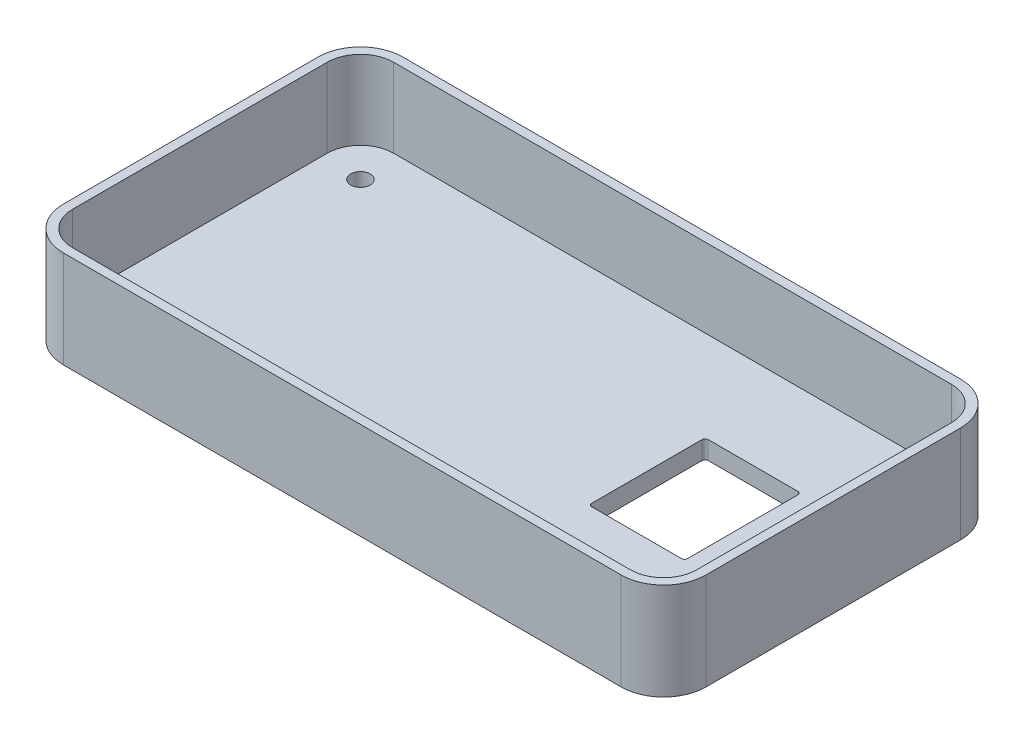
ISO-10303-21;
HEADER;
FILE_DESCRIPTION(('STEP AP214'),'2;1');
FILE_NAME('part.step','',(''),(''),'','','');
FILE_SCHEMA(('AUTOMOTIVE_DESIGN { 1 0 10303 214 1 1 1 1 }'));
ENDSEC;
DATA;
#1=APPLICATION_CONTEXT('core data for automotive mechanical design processes');
#2=APPLICATION_PROTOCOL_DEFINITION('international standard','automotive_design',2000,#1);
#3=PRODUCT_CONTEXT('',#1,'mechanical');
#4=PRODUCT('Part','Part','',(#3));
#5=PRODUCT_RELATED_PRODUCT_CATEGORY('part','',(#4));
#6=PRODUCT_DEFINITION_FORMATION('','',#4);
#7=PRODUCT_DEFINITION_CONTEXT('part definition',#1,'design');
#8=PRODUCT_DEFINITION('design','',#6,#7);
#9=PRODUCT_DEFINITION_SHAPE('','',#8);
#10=(LENGTH_UNIT() NAMED_UNIT(*) SI_UNIT(.MILLI.,.METRE.));
#11=(NAMED_UNIT(*) PLANE_ANGLE_UNIT() SI_UNIT($,.RADIAN.));
#12=(NAMED_UNIT(*) SI_UNIT($,.STERADIAN.) SOLID_ANGLE_UNIT());
#13=UNCERTAINTY_MEASURE_WITH_UNIT(LENGTH_MEASURE(1.E-05),#10,'distance_accuracy_value','');
#14=(GEOMETRIC_REPRESENTATION_CONTEXT(3) GLOBAL_UNCERTAINTY_ASSIGNED_CONTEXT((#13)) GLOBAL_UNIT_ASSIGNED_CONTEXT((#10,
#11,#12)) REPRESENTATION_CONTEXT('',''));
#15=CARTESIAN_POINT('',(0.,0.,0.));
#16=DIRECTION('',(0.,0.,1.));
#17=DIRECTION('',(1.,0.,0.));
#18=AXIS2_PLACEMENT_3D('',#15,#16,#17);
#19=CARTESIAN_POINT('',(0.,3.,-17.327051435572));
#20=DIRECTION('',(0.,0.,1.));
#21=DIRECTION('',(1.,0.,0.));
#22=AXIS2_PLACEMENT_3D('',#19,#20,#21);
#23=PLANE('',#22);
#24=DIRECTION('',(-1.,0.,0.));
#25=VECTOR('',#24,1.);
#26=CARTESIAN_POINT('',(0.,0.,-17.327051435572));
#27=LINE('',#26,#25);
#28=CARTESIAN_POINT('',(85.627156503708,0.,-17.327051435572));
#29=VERTEX_POINT('',#28);
#30=CARTESIAN_POINT('',(70.827156816136,0.,-17.327051435572));
#31=VERTEX_POINT('',#30);
#32=EDGE_CURVE('E233',#29,#31,#27,.T.);
#33=ORIENTED_EDGE('',*,*,#32,.T.);
#34=DIRECTION('',(0.,-1.,0.));
#35=VECTOR('',#34,1.);
#36=CARTESIAN_POINT('',(70.827156816136,3.,-17.327051435572));
#37=LINE('',#36,#35);
#38=CARTESIAN_POINT('',(70.827156816136,3.,-17.327051435572));
#39=VERTEX_POINT('',#38);
#40=EDGE_CURVE('E11',#39,#31,#37,.T.);
#41=ORIENTED_EDGE('',*,*,#40,.F.);
#42=DIRECTION('',(-1.,0.,0.));
#43=VECTOR('',#42,1.);
#44=CARTESIAN_POINT('',(0.,3.,-17.327051435572));
#45=LINE('',#44,#43);
#46=CARTESIAN_POINT('',(85.627156503708,3.,-17.327051435572));
#47=VERTEX_POINT('',#46);
#48=EDGE_CURVE('E451',#47,#39,#45,.T.);
#49=ORIENTED_EDGE('',*,*,#48,.F.);
#50=DIRECTION('',(0.,-1.,0.));
#51=VECTOR('',#50,1.);
#52=CARTESIAN_POINT('',(85.627156503708,3.,-17.327051435572));
#53=LINE('',#52,#51);
#54=EDGE_CURVE('E70',#47,#29,#53,.T.);
#55=ORIENTED_EDGE('',*,*,#54,.T.);
#56=EDGE_LOOP('',(#33,#41,#49,#55));
#57=FACE_BOUND('',#56,.T.);
#58=ADVANCED_FACE('F43',(#57),#23,.F.);
#59=CARTESIAN_POINT('',(70.827156816136,3.,-17.827051425017));
#60=DIRECTION('',(0.,-1.,0.));
#61=DIRECTION('',(0.,0.,-1.));
#62=AXIS2_PLACEMENT_3D('',#59,#60,#61);
#63=CYLINDRICAL_SURFACE('',#62,0.499999989445029);
#64=CARTESIAN_POINT('',(70.827156816136,0.,-17.827051425017));
#65=DIRECTION('',(0.,1.,0.));
#66=DIRECTION('',(0.,0.,1.));
#67=AXIS2_PLACEMENT_3D('',#64,#65,#66);
#68=CIRCLE('',#67,0.499999989445029);
#69=CARTESIAN_POINT('',(70.327156826691,0.,-17.827051425017));
#70=VERTEX_POINT('',#69);
#71=EDGE_CURVE('E236',#31,#70,#68,.F.);
#72=ORIENTED_EDGE('',*,*,#71,.T.);
#73=DIRECTION('',(0.,-1.,0.));
#74=VECTOR('',#73,1.);
#75=CARTESIAN_POINT('',(70.327156826691,3.,-17.827051425017));
#76=LINE('',#75,#74);
#77=CARTESIAN_POINT('',(70.327156826691,3.,-17.827051425017));
#78=VERTEX_POINT('',#77);
#79=EDGE_CURVE('E53',#78,#70,#76,.T.);
#80=ORIENTED_EDGE('',*,*,#79,.F.);
#81=CARTESIAN_POINT('',(70.827156816136,3.,-17.827051425017));
#82=DIRECTION('',(0.,1.,0.));
#83=DIRECTION('',(0.,0.,1.));
#84=AXIS2_PLACEMENT_3D('',#81,#82,#83);
#85=CIRCLE('',#84,0.499999989445029);
#86=EDGE_CURVE('E133',#39,#78,#85,.F.);
#87=ORIENTED_EDGE('',*,*,#86,.F.);
#88=ORIENTED_EDGE('',*,*,#40,.T.);
#89=EDGE_LOOP('',(#72,#80,#87,#88));
#90=FACE_BOUND('',#89,.T.);
#91=ADVANCED_FACE('F472',(#90),#63,.F.);
#92=CARTESIAN_POINT('',(70.327156826691,3.,0.));
#93=DIRECTION('',(-1.,0.,0.));
#94=DIRECTION('',(0.,0.,1.));
#95=AXIS2_PLACEMENT_3D('',#92,#93,#94);
#96=PLANE('',#95);
#97=DIRECTION('',(0.,0.,-1.));
#98=VECTOR('',#97,1.);
#99=CARTESIAN_POINT('',(70.327156826691,0.,0.));
#100=LINE('',#99,#98);
#101=CARTESIAN_POINT('',(70.327156826691,0.,-36.027051040815));
#102=VERTEX_POINT('',#101);
#103=EDGE_CURVE('E239',#70,#102,#100,.T.);
#104=ORIENTED_EDGE('',*,*,#103,.T.);
#105=DIRECTION('',(0.,-1.,0.));
#106=VECTOR('',#105,1.);
#107=CARTESIAN_POINT('',(70.327156826691,3.,-36.027051040815));
#108=LINE('',#107,#106);
#109=CARTESIAN_POINT('',(70.327156826691,3.,-36.027051040815));
#110=VERTEX_POINT('',#109);
#111=EDGE_CURVE('E269',#110,#102,#108,.T.);
#112=ORIENTED_EDGE('',*,*,#111,.F.);
#113=DIRECTION('',(0.,0.,-1.));
#114=VECTOR('',#113,1.);
#115=CARTESIAN_POINT('',(70.327156826691,3.,0.));
#116=LINE('',#115,#114);
#117=EDGE_CURVE('E456',#78,#110,#116,.T.);
#118=ORIENTED_EDGE('',*,*,#117,.F.);
#119=ORIENTED_EDGE('',*,*,#79,.T.);
#120=EDGE_LOOP('',(#104,#112,#118,#119));
#121=FACE_BOUND('',#120,.T.);
#122=ADVANCED_FACE('F475',(#121),#96,.F.);
#123=CARTESIAN_POINT('',(70.827156816136,3.,-36.027051040815));
#124=DIRECTION('',(0.,-1.,0.));
#125=DIRECTION('',(0.,0.,-1.));
#126=AXIS2_PLACEMENT_3D('',#123,#124,#125);
#127=CYLINDRICAL_SURFACE('',#126,0.499999989445003);
#128=CARTESIAN_POINT('',(70.827156816136,0.,-36.027051040815));
#129=DIRECTION('',(0.,1.,0.));
#130=DIRECTION('',(0.,0.,1.));
#131=AXIS2_PLACEMENT_3D('',#128,#129,#130);
#132=CIRCLE('',#131,0.499999989445003);
#133=CARTESIAN_POINT('',(70.827156816136,0.,-36.52705103026));
#134=VERTEX_POINT('',#133);
#135=EDGE_CURVE('E242',#102,#134,#132,.F.);
#136=ORIENTED_EDGE('',*,*,#135,.T.);
#137=DIRECTION('',(0.,-1.,0.));
#138=VECTOR('',#137,1.);
#139=CARTESIAN_POINT('',(70.827156816136,3.,-36.52705103026));
#140=LINE('',#139,#138);
#141=CARTESIAN_POINT('',(70.827156816136,3.,-36.52705103026));
#142=VERTEX_POINT('',#141);
#143=EDGE_CURVE('E265',#142,#134,#140,.T.);
#144=ORIENTED_EDGE('',*,*,#143,.F.);
#145=CARTESIAN_POINT('',(70.827156816136,3.,-36.027051040815));
#146=DIRECTION('',(0.,1.,0.));
#147=DIRECTION('',(0.,0.,1.));
#148=AXIS2_PLACEMENT_3D('',#145,#146,#147);
#149=CIRCLE('',#148,0.499999989445003);
#150=EDGE_CURVE('E180',#110,#142,#149,.F.);
#151=ORIENTED_EDGE('',*,*,#150,.F.);
#152=ORIENTED_EDGE('',*,*,#111,.T.);
#153=EDGE_LOOP('',(#136,#144,#151,#152));
#154=FACE_BOUND('',#153,.T.);
#155=ADVANCED_FACE('F464',(#154),#127,.F.);
#156=CARTESIAN_POINT('',(0.,3.,-36.52705103026));
#157=DIRECTION('',(0.,0.,-1.));
#158=DIRECTION('',(-1.,0.,0.));
#159=AXIS2_PLACEMENT_3D('',#156,#157,#158);
#160=PLANE('',#159);
#161=DIRECTION('',(1.,0.,0.));
#162=VECTOR('',#161,1.);
#163=CARTESIAN_POINT('',(0.,0.,-36.52705103026));
#164=LINE('',#163,#162);
#165=CARTESIAN_POINT('',(85.627156503708,0.,-36.52705103026));
#166=VERTEX_POINT('',#165);
#167=EDGE_CURVE('E245',#134,#166,#164,.T.);
#168=ORIENTED_EDGE('',*,*,#167,.T.);
#169=DIRECTION('',(0.,-1.,0.));
#170=VECTOR('',#169,1.);
#171=CARTESIAN_POINT('',(85.627156503708,3.,-36.52705103026));
#172=LINE('',#171,#170);
#173=CARTESIAN_POINT('',(85.627156503708,3.,-36.52705103026));
#174=VERTEX_POINT('',#173);
#175=EDGE_CURVE('E162',#174,#166,#172,.T.);
#176=ORIENTED_EDGE('',*,*,#175,.F.);
#177=DIRECTION('',(1.,0.,0.));
#178=VECTOR('',#177,1.);
#179=CARTESIAN_POINT('',(0.,3.,-36.52705103026));
#180=LINE('',#179,#178);
#181=EDGE_CURVE('E175',#142,#174,#180,.T.);
#182=ORIENTED_EDGE('',*,*,#181,.F.);
#183=ORIENTED_EDGE('',*,*,#143,.T.);
#184=EDGE_LOOP('',(#168,#176,#182,#183));
#185=FACE_BOUND('',#184,.T.);
#186=ADVANCED_FACE('F468',(#185),#160,.F.);
#187=CARTESIAN_POINT('',(85.627156503708,3.,-36.027051040815));
#188=DIRECTION('',(0.,-1.,0.));
#189=DIRECTION('',(0.,0.,-1.));
#190=AXIS2_PLACEMENT_3D('',#187,#188,#189);
#191=CYLINDRICAL_SURFACE('',#190,0.499999989444996);
#192=CARTESIAN_POINT('',(85.627156503708,0.,-36.027051040815));
#193=DIRECTION('',(0.,1.,0.));
#194=DIRECTION('',(0.,0.,1.));
#195=AXIS2_PLACEMENT_3D('',#192,#193,#194);
#196=CIRCLE('',#195,0.499999989444996);
#197=CARTESIAN_POINT('',(86.127156493153,0.,-36.027051040815));
#198=VERTEX_POINT('',#197);
#199=EDGE_CURVE('E157',#198,#166,#196,.T.);
#200=ORIENTED_EDGE('',*,*,#199,.F.);
#201=DIRECTION('',(0.,-1.,0.));
#202=VECTOR('',#201,1.);
#203=CARTESIAN_POINT('',(86.127156493153,3.,-36.027051040815));
#204=LINE('',#203,#202);
#205=CARTESIAN_POINT('',(86.127156493153,3.,-36.027051040815));
#206=VERTEX_POINT('',#205);
#207=EDGE_CURVE('E151',#206,#198,#204,.T.);
#208=ORIENTED_EDGE('',*,*,#207,.F.);
#209=CARTESIAN_POINT('',(85.627156503708,3.,-36.027051040815));
#210=DIRECTION('',(0.,1.,0.));
#211=DIRECTION('',(0.,0.,1.));
#212=AXIS2_PLACEMENT_3D('',#209,#210,#211);
#213=CIRCLE('',#212,0.499999989444996);
#214=EDGE_CURVE('E155',#206,#174,#213,.T.);
#215=ORIENTED_EDGE('',*,*,#214,.T.);
#216=ORIENTED_EDGE('',*,*,#175,.T.);
#217=EDGE_LOOP('',(#200,#208,#215,#216));
#218=FACE_BOUND('',#217,.T.);
#219=ADVANCED_FACE('F153',(#218),#191,.F.);
#220=CARTESIAN_POINT('',(86.127156493153,3.,0.));
#221=DIRECTION('',(1.,0.,0.));
#222=DIRECTION('',(0.,0.,-1.));
#223=AXIS2_PLACEMENT_3D('',#220,#221,#222);
#224=PLANE('',#223);
#225=DIRECTION('',(0.,0.,1.));
#226=VECTOR('',#225,1.);
#227=CARTESIAN_POINT('',(86.127156493153,0.,0.));
#228=LINE('',#227,#226);
#229=CARTESIAN_POINT('',(86.127156493153,0.,-17.827051425017));
#230=VERTEX_POINT('',#229);
#231=EDGE_CURVE('E251',#198,#230,#228,.T.);
#232=ORIENTED_EDGE('',*,*,#231,.T.);
#233=DIRECTION('',(0.,-1.,0.));
#234=VECTOR('',#233,1.);
#235=CARTESIAN_POINT('',(86.127156493153,3.,-17.827051425017));
#236=LINE('',#235,#234);
#237=CARTESIAN_POINT('',(86.127156493153,3.,-17.827051425017));
#238=VERTEX_POINT('',#237);
#239=EDGE_CURVE('E163',#238,#230,#236,.T.);
#240=ORIENTED_EDGE('',*,*,#239,.F.);
#241=DIRECTION('',(0.,0.,1.));
#242=VECTOR('',#241,1.);
#243=CARTESIAN_POINT('',(86.127156493153,3.,0.));
#244=LINE('',#243,#242);
#245=EDGE_CURVE('E166',#206,#238,#244,.T.);
#246=ORIENTED_EDGE('',*,*,#245,.F.);
#247=ORIENTED_EDGE('',*,*,#207,.T.);
#248=EDGE_LOOP('',(#232,#240,#246,#247));
#249=FACE_BOUND('',#248,.T.);
#250=ADVANCED_FACE('F167',(#249),#224,.F.);
#251=CARTESIAN_POINT('',(0.,3.,-52.987399034798));
#252=DIRECTION('',(0.,0.,1.));
#253=DIRECTION('',(1.,0.,0.));
#254=AXIS2_PLACEMENT_3D('',#251,#252,#253);
#255=PLANE('',#254);
#256=DIRECTION('',(-1.,0.,0.));
#257=VECTOR('',#256,1.);
#258=CARTESIAN_POINT('',(0.,0.,-52.987399034798));
#259=LINE('',#258,#257);
#260=CARTESIAN_POINT('',(96.000193040386,0.,-52.987399034798));
#261=VERTEX_POINT('',#260);
#262=CARTESIAN_POINT('',(4.00000762001502,0.,-52.987399034798));
#263=VERTEX_POINT('',#262);
#264=EDGE_CURVE('E187',#261,#263,#259,.T.);
#265=ORIENTED_EDGE('',*,*,#264,.T.);
#266=DIRECTION('',(0.,-1.,0.));
#267=VECTOR('',#266,1.);
#268=CARTESIAN_POINT('',(4.00000762001502,3.,-52.987399034798));
#269=LINE('',#268,#267);
#270=CARTESIAN_POINT('',(4.00000762001502,16.,-52.987399034798));
#271=VERTEX_POINT('',#270);
#272=EDGE_CURVE('E47',#271,#263,#269,.T.);
#273=ORIENTED_EDGE('',*,*,#272,.F.);
#274=DIRECTION('',(-1.,0.,0.));
#275=VECTOR('',#274,1.);
#276=CARTESIAN_POINT('',(0.,16.,-52.987399034798));
#277=LINE('',#276,#275);
#278=CARTESIAN_POINT('',(96.000193040386,16.,-52.987399034798));
#279=VERTEX_POINT('',#278);
#280=EDGE_CURVE('E993',#279,#271,#277,.T.);
#281=ORIENTED_EDGE('',*,*,#280,.F.);
#282=DIRECTION('',(0.,-1.,0.));
#283=VECTOR('',#282,1.);
#284=CARTESIAN_POINT('',(96.000193040386,3.,-52.987399034798));
#285=LINE('',#284,#283);
#286=EDGE_CURVE('E186',#279,#261,#285,.T.);
#287=ORIENTED_EDGE('',*,*,#286,.T.);
#288=EDGE_LOOP('',(#265,#273,#281,#287));
#289=FACE_BOUND('',#288,.T.);
#290=ADVANCED_FACE('F45',(#289),#255,.F.);
#291=CARTESIAN_POINT('',(4.00000762001501,3.,-46.000091440183));
#292=DIRECTION('',(0.,-1.,0.));
#293=DIRECTION('',(0.,0.,-1.));
#294=AXIS2_PLACEMENT_3D('',#291,#292,#293);
#295=CYLINDRICAL_SURFACE('',#294,6.98730759461496);
#296=CARTESIAN_POINT('',(4.00000762001501,0.,-46.000091440183));
#297=DIRECTION('',(0.,1.,0.));
#298=DIRECTION('',(0.,0.,1.));
#299=AXIS2_PLACEMENT_3D('',#296,#297,#298);
#300=CIRCLE('',#299,6.98730759461496);
#301=CARTESIAN_POINT('',(-2.98729997459995,0.,-46.000091440183));
#302=VERTEX_POINT('',#301);
#303=EDGE_CURVE('E191',#302,#263,#300,.F.);
#304=ORIENTED_EDGE('',*,*,#303,.F.);
#305=DIRECTION('',(0.,-1.,0.));
#306=VECTOR('',#305,1.);
#307=CARTESIAN_POINT('',(-2.98729997459995,3.,-46.000091440183));
#308=LINE('',#307,#306);
#309=CARTESIAN_POINT('',(-2.98729997459995,16.,-46.000091440183));
#310=VERTEX_POINT('',#309);
#311=EDGE_CURVE('E295',#310,#302,#308,.T.);
#312=ORIENTED_EDGE('',*,*,#311,.F.);
#313=CARTESIAN_POINT('',(4.00000762001501,16.,-46.000091440183));
#314=DIRECTION('',(0.,1.,0.));
#315=DIRECTION('',(0.,0.,1.));
#316=AXIS2_PLACEMENT_3D('',#313,#314,#315);
#317=CIRCLE('',#316,6.98730759461496);
#318=EDGE_CURVE('E309',#310,#271,#317,.F.);
#319=ORIENTED_EDGE('',*,*,#318,.T.);
#320=ORIENTED_EDGE('',*,*,#272,.T.);
#321=EDGE_LOOP('',(#304,#312,#319,#320));
#322=FACE_BOUND('',#321,.T.);
#323=ADVANCED_FACE('F306',(#322),#295,.T.);
#324=CARTESIAN_POINT('',(-2.98729997459995,3.,0.));
#325=DIRECTION('',(1.,0.,0.));
#326=DIRECTION('',(0.,0.,-1.));
#327=AXIS2_PLACEMENT_3D('',#324,#325,#326);
#328=PLANE('',#327);
#329=DIRECTION('',(0.,0.,1.));
#330=VECTOR('',#329,1.);
#331=CARTESIAN_POINT('',(-2.98729997459995,0.,0.));
#332=LINE('',#331,#330);
#333=CARTESIAN_POINT('',(-2.98729997459995,0.,-4.000007620015));
#334=VERTEX_POINT('',#333);
#335=EDGE_CURVE('E196',#302,#334,#332,.T.);
#336=ORIENTED_EDGE('',*,*,#335,.T.);
#337=DIRECTION('',(0.,-1.,0.));
#338=VECTOR('',#337,1.);
#339=CARTESIAN_POINT('',(-2.98729997459995,3.,-4.000007620015));
#340=LINE('',#339,#338);
#341=CARTESIAN_POINT('',(-2.98729997459995,16.,-4.000007620015));
#342=VERTEX_POINT('',#341);
#343=EDGE_CURVE('E292',#342,#334,#340,.T.);
#344=ORIENTED_EDGE('',*,*,#343,.F.);
#345=DIRECTION('',(0.,0.,1.));
#346=VECTOR('',#345,1.);
#347=CARTESIAN_POINT('',(-2.98729997459995,16.,0.));
#348=LINE('',#347,#346);
#349=EDGE_CURVE('E338',#310,#342,#348,.T.);
#350=ORIENTED_EDGE('',*,*,#349,.F.);
#351=ORIENTED_EDGE('',*,*,#311,.T.);
#352=EDGE_LOOP('',(#336,#344,#350,#351));
#353=FACE_BOUND('',#352,.T.);
#354=ADVANCED_FACE('F321',(#353),#328,.F.);
#355=CARTESIAN_POINT('',(4.00000762001502,3.,-4.00000762001502));
#356=DIRECTION('',(0.,-1.,0.));
#357=DIRECTION('',(0.,0.,-1.));
#358=AXIS2_PLACEMENT_3D('',#355,#356,#357);
#359=CYLINDRICAL_SURFACE('',#358,6.98730759461497);
#360=CARTESIAN_POINT('',(4.00000762001502,0.,-4.00000762001502));
#361=DIRECTION('',(0.,1.,0.));
#362=DIRECTION('',(0.,0.,1.));
#363=AXIS2_PLACEMENT_3D('',#360,#361,#362);
#364=CIRCLE('',#363,6.98730759461497);
#365=CARTESIAN_POINT('',(4.00000762001502,0.,2.98729997459995));
#366=VERTEX_POINT('',#365);
#367=EDGE_CURVE('E199',#334,#366,#364,.T.);
#368=ORIENTED_EDGE('',*,*,#367,.T.);
#369=DIRECTION('',(0.,-1.,0.));
#370=VECTOR('',#369,1.);
#371=CARTESIAN_POINT('',(4.00000762001502,3.,2.98729997459995));
#372=LINE('',#371,#370);
#373=CARTESIAN_POINT('',(4.00000762001502,16.,2.98729997459995));
#374=VERTEX_POINT('',#373);
#375=EDGE_CURVE('E288',#374,#366,#372,.T.);
#376=ORIENTED_EDGE('',*,*,#375,.F.);
#377=CARTESIAN_POINT('',(4.00000762001502,16.,-4.00000762001502));
#378=DIRECTION('',(0.,1.,0.));
#379=DIRECTION('',(0.,0.,1.));
#380=AXIS2_PLACEMENT_3D('',#377,#378,#379);
#381=CIRCLE('',#380,6.98730759461497);
#382=EDGE_CURVE('E329',#342,#374,#381,.T.);
#383=ORIENTED_EDGE('',*,*,#382,.F.);
#384=ORIENTED_EDGE('',*,*,#343,.T.);
#385=EDGE_LOOP('',(#368,#376,#383,#384));
#386=FACE_BOUND('',#385,.T.);
#387=ADVANCED_FACE('F326',(#386),#359,.T.);
#388=CARTESIAN_POINT('',(0.,3.,2.98729997459995));
#389=DIRECTION('',(0.,0.,-1.));
#390=DIRECTION('',(-1.,0.,0.));
#391=AXIS2_PLACEMENT_3D('',#388,#389,#390);
#392=PLANE('',#391);
#393=DIRECTION('',(1.,0.,0.));
#394=VECTOR('',#393,1.);
#395=CARTESIAN_POINT('',(0.,0.,2.98729997459995));
#396=LINE('',#395,#394);
#397=CARTESIAN_POINT('',(96.000193040386,0.,2.98729997459995));
#398=VERTEX_POINT('',#397);
#399=EDGE_CURVE('E202',#366,#398,#396,.T.);
#400=ORIENTED_EDGE('',*,*,#399,.T.);
#401=DIRECTION('',(0.,-1.,0.));
#402=VECTOR('',#401,1.);
#403=CARTESIAN_POINT('',(96.000193040386,3.,2.98729997459995));
#404=LINE('',#403,#402);
#405=CARTESIAN_POINT('',(96.000193040386,16.,2.98729997459995));
#406=VERTEX_POINT('',#405);
#407=EDGE_CURVE('E284',#406,#398,#404,.T.);
#408=ORIENTED_EDGE('',*,*,#407,.F.);
#409=DIRECTION('',(1.,0.,0.));
#410=VECTOR('',#409,1.);
#411=CARTESIAN_POINT('',(0.,16.,2.98729997459995));
#412=LINE('',#411,#410);
#413=EDGE_CURVE('E914',#374,#406,#412,.T.);
#414=ORIENTED_EDGE('',*,*,#413,.F.);
#415=ORIENTED_EDGE('',*,*,#375,.T.);
#416=EDGE_LOOP('',(#400,#408,#414,#415));
#417=FACE_BOUND('',#416,.T.);
#418=ADVANCED_FACE('F516',(#417),#392,.F.);
#419=CARTESIAN_POINT('',(96.000193040386,3.,-4.00000762001507));
#420=DIRECTION('',(0.,-1.,0.));
#421=DIRECTION('',(0.,0.,-1.));
#422=AXIS2_PLACEMENT_3D('',#419,#420,#421);
#423=CYLINDRICAL_SURFACE('',#422,6.98730759461502);
#424=CARTESIAN_POINT('',(96.000193040386,0.,-4.00000762001507));
#425=DIRECTION('',(0.,1.,0.));
#426=DIRECTION('',(0.,0.,1.));
#427=AXIS2_PLACEMENT_3D('',#424,#425,#426);
#428=CIRCLE('',#427,6.98730759461502);
#429=CARTESIAN_POINT('',(102.987500635001,0.,-4.00000762001502));
#430=VERTEX_POINT('',#429);
#431=EDGE_CURVE('E205',#398,#430,#428,.T.);
#432=ORIENTED_EDGE('',*,*,#431,.T.);
#433=DIRECTION('',(0.,-1.,0.));
#434=VECTOR('',#433,1.);
#435=CARTESIAN_POINT('',(102.987500635001,3.,-4.00000762001502));
#436=LINE('',#435,#434);
#437=CARTESIAN_POINT('',(102.987500635001,16.,-4.00000762001502));
#438=VERTEX_POINT('',#437);
#439=EDGE_CURVE('E281',#438,#430,#436,.T.);
#440=ORIENTED_EDGE('',*,*,#439,.F.);
#441=CARTESIAN_POINT('',(96.000193040386,16.,-4.00000762001507));
#442=DIRECTION('',(0.,1.,0.));
#443=DIRECTION('',(0.,0.,1.));
#444=AXIS2_PLACEMENT_3D('',#441,#442,#443);
#445=CIRCLE('',#444,6.98730759461502);
#446=EDGE_CURVE('E978',#406,#438,#445,.T.);
#447=ORIENTED_EDGE('',*,*,#446,.F.);
#448=ORIENTED_EDGE('',*,*,#407,.T.);
#449=EDGE_LOOP('',(#432,#440,#447,#448));
#450=FACE_BOUND('',#449,.T.);
#451=ADVANCED_FACE('F512',(#450),#423,.T.);
#452=CARTESIAN_POINT('',(102.987500635001,3.,0.));
#453=DIRECTION('',(1.,0.,0.));
#454=DIRECTION('',(0.,0.,-1.));
#455=AXIS2_PLACEMENT_3D('',#452,#453,#454);
#456=PLANE('',#455);
#457=DIRECTION('',(0.,0.,1.));
#458=VECTOR('',#457,1.);
#459=CARTESIAN_POINT('',(102.987500635001,0.,0.));
#460=LINE('',#459,#458);
#461=CARTESIAN_POINT('',(102.987500635001,0.,-46.000091440183));
#462=VERTEX_POINT('',#461);
#463=EDGE_CURVE('E209',#462,#430,#460,.T.);
#464=ORIENTED_EDGE('',*,*,#463,.F.);
#465=DIRECTION('',(0.,-1.,0.));
#466=VECTOR('',#465,1.);
#467=CARTESIAN_POINT('',(102.987500635001,3.,-46.000091440183));
#468=LINE('',#467,#466);
#469=CARTESIAN_POINT('',(102.987500635001,16.,-46.000091440183));
#470=VERTEX_POINT('',#469);
#471=EDGE_CURVE('E278',#470,#462,#468,.T.);
#472=ORIENTED_EDGE('',*,*,#471,.F.);
#473=DIRECTION('',(0.,0.,1.));
#474=VECTOR('',#473,1.);
#475=CARTESIAN_POINT('',(102.987500635001,16.,0.));
#476=LINE('',#475,#474);
#477=EDGE_CURVE('E982',#470,#438,#476,.T.);
#478=ORIENTED_EDGE('',*,*,#477,.T.);
#479=ORIENTED_EDGE('',*,*,#439,.T.);
#480=EDGE_LOOP('',(#464,#472,#478,#479));
#481=FACE_BOUND('',#480,.T.);
#482=ADVANCED_FACE('F493',(#481),#456,.T.);
#483=CARTESIAN_POINT('',(95.000190500381,3.,-45.000088900178));
#484=DIRECTION('',(0.,-1.,0.));
#485=DIRECTION('',(0.,0.,-1.));
#486=AXIS2_PLACEMENT_3D('',#483,#484,#485);
#487=CYLINDRICAL_SURFACE('',#486,1.600003175006);
#488=CARTESIAN_POINT('',(95.000190500381,3.,-45.000088900178));
#489=DIRECTION('',(0.,1.,0.));
#490=DIRECTION('',(0.,0.,1.));
#491=AXIS2_PLACEMENT_3D('',#488,#489,#490);
#492=CIRCLE('',#491,1.600003175006);
#493=CARTESIAN_POINT('',(95.000190500381,3.,-43.400085725172));
#494=VERTEX_POINT('',#493);
#495=EDGE_CURVE('E447',#494,#494,#492,.T.);
#496=ORIENTED_EDGE('',*,*,#495,.T.);
#497=EDGE_LOOP('',(#496));
#498=FACE_BOUND('',#497,.T.);
#499=CARTESIAN_POINT('',(95.000190500381,0.,-45.000088900178));
#500=DIRECTION('',(0.,1.,0.));
#501=DIRECTION('',(0.,0.,1.));
#502=AXIS2_PLACEMENT_3D('',#499,#500,#501);
#503=CIRCLE('',#502,1.600003175006);
#504=CARTESIAN_POINT('',(95.000190500381,0.,-43.400085725172));
#505=VERTEX_POINT('',#504);
#506=EDGE_CURVE('E229',#505,#505,#503,.T.);
#507=ORIENTED_EDGE('',*,*,#506,.F.);
#508=EDGE_LOOP('',(#507));
#509=FACE_BOUND('',#508,.T.);
#510=ADVANCED_FACE('F489',(#498,#509),#487,.F.);
#511=CARTESIAN_POINT('',(95.000190500381,3.,-5.00001016002));
#512=DIRECTION('',(0.,-1.,0.));
#513=DIRECTION('',(0.,0.,-1.));
#514=AXIS2_PLACEMENT_3D('',#511,#512,#513);
#515=CYLINDRICAL_SURFACE('',#514,1.600003175006);
#516=CARTESIAN_POINT('',(95.000190500381,3.,-5.00001016002));
#517=DIRECTION('',(0.,1.,0.));
#518=DIRECTION('',(0.,0.,1.));
#519=AXIS2_PLACEMENT_3D('',#516,#517,#518);
#520=CIRCLE('',#519,1.600003175006);
#521=CARTESIAN_POINT('',(95.000190500381,3.,-3.400006985014));
#522=VERTEX_POINT('',#521);
#523=EDGE_CURVE('E443',#522,#522,#520,.T.);
#524=ORIENTED_EDGE('',*,*,#523,.T.);
#525=EDGE_LOOP('',(#524));
#526=FACE_BOUND('',#525,.T.);
#527=CARTESIAN_POINT('',(95.000190500381,0.,-5.00001016002));
#528=DIRECTION('',(0.,1.,0.));
#529=DIRECTION('',(0.,0.,1.));
#530=AXIS2_PLACEMENT_3D('',#527,#528,#529);
#531=CIRCLE('',#530,1.600003175006);
#532=CARTESIAN_POINT('',(95.000190500381,0.,-3.400006985014));
#533=VERTEX_POINT('',#532);
#534=EDGE_CURVE('E225',#533,#533,#531,.T.);
#535=ORIENTED_EDGE('',*,*,#534,.F.);
#536=EDGE_LOOP('',(#535));
#537=FACE_BOUND('',#536,.T.);
#538=ADVANCED_FACE('F492',(#526,#537),#515,.F.);
#539=CARTESIAN_POINT('',(5.0000101600205,3.,-5.00001016002));
#540=DIRECTION('',(0.,-1.,0.));
#541=DIRECTION('',(0.,0.,-1.));
#542=AXIS2_PLACEMENT_3D('',#539,#540,#541);
#543=CYLINDRICAL_SURFACE('',#542,1.6000031750065);
#544=CARTESIAN_POINT('',(5.0000101600205,3.,-5.00001016002));
#545=DIRECTION('',(0.,1.,0.));
#546=DIRECTION('',(0.,0.,1.));
#547=AXIS2_PLACEMENT_3D('',#544,#545,#546);
#548=CIRCLE('',#547,1.6000031750065);
#549=CARTESIAN_POINT('',(5.0000101600205,3.,-3.4000069850135));
#550=VERTEX_POINT('',#549);
#551=EDGE_CURVE('E439',#550,#550,#548,.T.);
#552=ORIENTED_EDGE('',*,*,#551,.T.);
#553=EDGE_LOOP('',(#552));
#554=FACE_BOUND('',#553,.T.);
#555=CARTESIAN_POINT('',(5.0000101600205,0.,-5.00001016002));
#556=DIRECTION('',(0.,1.,0.));
#557=DIRECTION('',(0.,0.,1.));
#558=AXIS2_PLACEMENT_3D('',#555,#556,#557);
#559=CIRCLE('',#558,1.6000031750065);
#560=CARTESIAN_POINT('',(5.0000101600205,0.,-3.4000069850135));
#561=VERTEX_POINT('',#560);
#562=EDGE_CURVE('E221',#561,#561,#559,.T.);
#563=ORIENTED_EDGE('',*,*,#562,.F.);
#564=EDGE_LOOP('',(#563));
#565=FACE_BOUND('',#564,.T.);
#566=ADVANCED_FACE('F497',(#554,#565),#543,.F.);
#567=CARTESIAN_POINT('',(5.00001016002,3.,-45.000088900178));
#568=DIRECTION('',(0.,-1.,0.));
#569=DIRECTION('',(0.,0.,-1.));
#570=AXIS2_PLACEMENT_3D('',#567,#568,#569);
#571=CYLINDRICAL_SURFACE('',#570,1.6000031750065);
#572=CARTESIAN_POINT('',(5.00001016002,3.,-45.000088900178));
#573=DIRECTION('',(0.,1.,0.));
#574=DIRECTION('',(0.,0.,1.));
#575=AXIS2_PLACEMENT_3D('',#572,#573,#574);
#576=CIRCLE('',#575,1.6000031750065);
#577=CARTESIAN_POINT('',(5.00001016002,3.,-43.4000857251715));
#578=VERTEX_POINT('',#577);
#579=EDGE_CURVE('E258',#578,#578,#576,.T.);
#580=ORIENTED_EDGE('',*,*,#579,.T.);
#581=EDGE_LOOP('',(#580));
#582=FACE_BOUND('',#581,.T.);
#583=CARTESIAN_POINT('',(5.00001016002,0.,-45.000088900178));
#584=DIRECTION('',(0.,1.,0.));
#585=DIRECTION('',(0.,0.,1.));
#586=AXIS2_PLACEMENT_3D('',#583,#584,#585);
#587=CIRCLE('',#586,1.6000031750065);
#588=CARTESIAN_POINT('',(5.00001016002,0.,-43.4000857251715));
#589=VERTEX_POINT('',#588);
#590=EDGE_CURVE('E217',#589,#589,#587,.T.);
#591=ORIENTED_EDGE('',*,*,#590,.F.);
#592=EDGE_LOOP('',(#591));
#593=FACE_BOUND('',#592,.T.);
#594=ADVANCED_FACE('F501',(#582,#593),#571,.F.);
#595=CARTESIAN_POINT('',(96.000193040386,3.,-46.000091440183));
#596=DIRECTION('',(0.,-1.,0.));
#597=DIRECTION('',(0.,0.,-1.));
#598=AXIS2_PLACEMENT_3D('',#595,#596,#597);
#599=CYLINDRICAL_SURFACE('',#598,6.987307594615);
#600=CARTESIAN_POINT('',(96.000193040386,0.,-46.000091440183));
#601=DIRECTION('',(0.,1.,0.));
#602=DIRECTION('',(0.,0.,1.));
#603=AXIS2_PLACEMENT_3D('',#600,#601,#602);
#604=CIRCLE('',#603,6.987307594615);
#605=EDGE_CURVE('E213',#261,#462,#604,.F.);
#606=ORIENTED_EDGE('',*,*,#605,.F.);
#607=ORIENTED_EDGE('',*,*,#286,.F.);
#608=CARTESIAN_POINT('',(96.000193040386,16.,-46.000091440183));
#609=DIRECTION('',(0.,1.,0.));
#610=DIRECTION('',(0.,0.,1.));
#611=AXIS2_PLACEMENT_3D('',#608,#609,#610);
#612=CIRCLE('',#611,6.987307594615);
#613=EDGE_CURVE('E986',#279,#470,#612,.F.);
#614=ORIENTED_EDGE('',*,*,#613,.T.);
#615=ORIENTED_EDGE('',*,*,#471,.T.);
#616=EDGE_LOOP('',(#606,#607,#614,#615));
#617=FACE_BOUND('',#616,.T.);
#618=ADVANCED_FACE('F505',(#617),#599,.T.);
#619=CARTESIAN_POINT('',(85.627156503708,3.,-17.827051425017));
#620=DIRECTION('',(0.,-1.,0.));
#621=DIRECTION('',(0.,0.,-1.));
#622=AXIS2_PLACEMENT_3D('',#619,#620,#621);
#623=CYLINDRICAL_SURFACE('',#622,0.499999989444985);
#624=CARTESIAN_POINT('',(85.627156503708,0.,-17.827051425017));
#625=DIRECTION('',(0.,1.,0.));
#626=DIRECTION('',(0.,0.,1.));
#627=AXIS2_PLACEMENT_3D('',#624,#625,#626);
#628=CIRCLE('',#627,0.499999989444985);
#629=EDGE_CURVE('E254',#29,#230,#628,.T.);
#630=ORIENTED_EDGE('',*,*,#629,.F.);
#631=ORIENTED_EDGE('',*,*,#54,.F.);
#632=CARTESIAN_POINT('',(85.627156503708,3.,-17.827051425017));
#633=DIRECTION('',(0.,1.,0.));
#634=DIRECTION('',(0.,0.,1.));
#635=AXIS2_PLACEMENT_3D('',#632,#633,#634);
#636=CIRCLE('',#635,0.499999989444985);
#637=EDGE_CURVE('E171',#47,#238,#636,.T.);
#638=ORIENTED_EDGE('',*,*,#637,.T.);
#639=ORIENTED_EDGE('',*,*,#239,.T.);
#640=EDGE_LOOP('',(#630,#631,#638,#639));
#641=FACE_BOUND('',#640,.T.);
#642=ADVANCED_FACE('F470',(#641),#623,.F.);
#643=CARTESIAN_POINT('',(0.,3.,0.));
#644=DIRECTION('',(0.,1.,0.));
#645=DIRECTION('',(0.,0.,1.));
#646=AXIS2_PLACEMENT_3D('',#643,#644,#645);
#647=PLANE('',#646);
#648=CARTESIAN_POINT('',(96.000193040386,3.,-4.00000762001506));
#649=DIRECTION('',(0.,1.,0.));
#650=DIRECTION('',(0.,0.,1.));
#651=AXIS2_PLACEMENT_3D('',#648,#649,#650);
#652=CIRCLE('',#651,5.48730759461502);
#653=CARTESIAN_POINT('',(101.487500635001,3.,-4.00000762001501));
#654=VERTEX_POINT('',#653);
#655=CARTESIAN_POINT('',(96.000193040386,3.,1.48729997459995));
#656=VERTEX_POINT('',#655);
#657=EDGE_CURVE('E192',#654,#656,#652,.F.);
#658=ORIENTED_EDGE('',*,*,#657,.F.);
#659=DIRECTION('',(0.,0.,-1.));
#660=VECTOR('',#659,1.);
#661=CARTESIAN_POINT('',(101.487500635001,3.,0.));
#662=LINE('',#661,#660);
#663=CARTESIAN_POINT('',(101.487500635001,3.,-46.000091440183));
#664=VERTEX_POINT('',#663);
#665=EDGE_CURVE('E405',#654,#664,#662,.T.);
#666=ORIENTED_EDGE('',*,*,#665,.T.);
#667=CARTESIAN_POINT('',(96.000193040386,3.,-46.000091440183));
#668=DIRECTION('',(0.,1.,0.));
#669=DIRECTION('',(0.,0.,1.));
#670=AXIS2_PLACEMENT_3D('',#667,#668,#669);
#671=CIRCLE('',#670,5.48730759461502);
#672=CARTESIAN_POINT('',(96.000193040386,3.,-51.487399034798));
#673=VERTEX_POINT('',#672);
#674=EDGE_CURVE('E409',#664,#673,#671,.T.);
#675=ORIENTED_EDGE('',*,*,#674,.T.);
#676=DIRECTION('',(-1.,0.,0.));
#677=VECTOR('',#676,1.);
#678=CARTESIAN_POINT('',(0.,3.,-51.487399034798));
#679=LINE('',#678,#677);
#680=CARTESIAN_POINT('',(4.00000762001501,3.,-51.487399034798));
#681=VERTEX_POINT('',#680);
#682=EDGE_CURVE('E413',#673,#681,#679,.T.);
#683=ORIENTED_EDGE('',*,*,#682,.T.);
#684=CARTESIAN_POINT('',(4.00000762001501,3.,-46.000091440183));
#685=DIRECTION('',(0.,1.,0.));
#686=DIRECTION('',(0.,0.,1.));
#687=AXIS2_PLACEMENT_3D('',#684,#685,#686);
#688=CIRCLE('',#687,5.48730759461496);
#689=CARTESIAN_POINT('',(-1.48729997459995,3.,-46.000091440183));
#690=VERTEX_POINT('',#689);
#691=EDGE_CURVE('E417',#681,#690,#688,.T.);
#692=ORIENTED_EDGE('',*,*,#691,.T.);
#693=DIRECTION('',(0.,0.,1.));
#694=VECTOR('',#693,1.);
#695=CARTESIAN_POINT('',(-1.48729997459995,3.,0.));
#696=LINE('',#695,#694);
#697=CARTESIAN_POINT('',(-1.48729997459995,3.,-4.000007620015));
#698=VERTEX_POINT('',#697);
#699=EDGE_CURVE('E421',#690,#698,#696,.T.);
#700=ORIENTED_EDGE('',*,*,#699,.T.);
#701=CARTESIAN_POINT('',(4.00000762001501,3.,-4.00000762001501));
#702=DIRECTION('',(0.,1.,0.));
#703=DIRECTION('',(0.,0.,1.));
#704=AXIS2_PLACEMENT_3D('',#701,#702,#703);
#705=CIRCLE('',#704,5.48730759461496);
#706=CARTESIAN_POINT('',(4.00000762001501,3.,1.48729997459995));
#707=VERTEX_POINT('',#706);
#708=EDGE_CURVE('E425',#707,#698,#705,.F.);
#709=ORIENTED_EDGE('',*,*,#708,.F.);
#710=DIRECTION('',(1.,0.,0.));
#711=VECTOR('',#710,1.);
#712=CARTESIAN_POINT('',(0.,3.,1.48729997459995));
#713=LINE('',#712,#711);
#714=EDGE_CURVE('E429',#707,#656,#713,.T.);
#715=ORIENTED_EDGE('',*,*,#714,.T.);
#716=EDGE_LOOP('',(#658,#666,#675,#683,#692,#700,#709,#715));
#717=FACE_BOUND('',#716,.T.);
#718=ORIENTED_EDGE('',*,*,#579,.F.);
#719=EDGE_LOOP('',(#718));
#720=FACE_BOUND('',#719,.T.);
#721=ORIENTED_EDGE('',*,*,#551,.F.);
#722=EDGE_LOOP('',(#721));
#723=FACE_BOUND('',#722,.T.);
#724=ORIENTED_EDGE('',*,*,#523,.F.);
#725=EDGE_LOOP('',(#724));
#726=FACE_BOUND('',#725,.T.);
#727=ORIENTED_EDGE('',*,*,#495,.F.);
#728=EDGE_LOOP('',(#727));
#729=FACE_BOUND('',#728,.T.);
#730=ORIENTED_EDGE('',*,*,#48,.T.);
#731=ORIENTED_EDGE('',*,*,#86,.T.);
#732=ORIENTED_EDGE('',*,*,#117,.T.);
#733=ORIENTED_EDGE('',*,*,#150,.T.);
#734=ORIENTED_EDGE('',*,*,#181,.T.);
#735=ORIENTED_EDGE('',*,*,#214,.F.);
#736=ORIENTED_EDGE('',*,*,#245,.T.);
#737=ORIENTED_EDGE('',*,*,#637,.F.);
#738=EDGE_LOOP('',(#730,#731,#732,#733,#734,#735,#736,#737));
#739=FACE_BOUND('',#738,.T.);
#740=ADVANCED_FACE('F173',(#717,#720,#723,#726,#729,#739),#647,.T.);
#741=CARTESIAN_POINT('',(0.,0.,0.));
#742=DIRECTION('',(0.,1.,0.));
#743=DIRECTION('',(0.,0.,1.));
#744=AXIS2_PLACEMENT_3D('',#741,#742,#743);
#745=PLANE('',#744);
#746=ORIENTED_EDGE('',*,*,#590,.T.);
#747=EDGE_LOOP('',(#746));
#748=FACE_BOUND('',#747,.T.);
#749=ORIENTED_EDGE('',*,*,#562,.T.);
#750=EDGE_LOOP('',(#749));
#751=FACE_BOUND('',#750,.T.);
#752=ORIENTED_EDGE('',*,*,#534,.T.);
#753=EDGE_LOOP('',(#752));
#754=FACE_BOUND('',#753,.T.);
#755=ORIENTED_EDGE('',*,*,#506,.T.);
#756=EDGE_LOOP('',(#755));
#757=FACE_BOUND('',#756,.T.);
#758=ORIENTED_EDGE('',*,*,#32,.F.);
#759=ORIENTED_EDGE('',*,*,#629,.T.);
#760=ORIENTED_EDGE('',*,*,#231,.F.);
#761=ORIENTED_EDGE('',*,*,#199,.T.);
#762=ORIENTED_EDGE('',*,*,#167,.F.);
#763=ORIENTED_EDGE('',*,*,#135,.F.);
#764=ORIENTED_EDGE('',*,*,#103,.F.);
#765=ORIENTED_EDGE('',*,*,#71,.F.);
#766=EDGE_LOOP('',(#758,#759,#760,#761,#762,#763,#764,#765));
#767=FACE_BOUND('',#766,.T.);
#768=ORIENTED_EDGE('',*,*,#264,.F.);
#769=ORIENTED_EDGE('',*,*,#605,.T.);
#770=ORIENTED_EDGE('',*,*,#463,.T.);
#771=ORIENTED_EDGE('',*,*,#431,.F.);
#772=ORIENTED_EDGE('',*,*,#399,.F.);
#773=ORIENTED_EDGE('',*,*,#367,.F.);
#774=ORIENTED_EDGE('',*,*,#335,.F.);
#775=ORIENTED_EDGE('',*,*,#303,.T.);
#776=EDGE_LOOP('',(#768,#769,#770,#771,#772,#773,#774,#775));
#777=FACE_BOUND('',#776,.T.);
#778=ADVANCED_FACE('F317',(#748,#751,#754,#757,#767,#777),#745,.F.);
#779=CARTESIAN_POINT('',(96.000193040386,16.,-4.00000762001506));
#780=DIRECTION('',(0.,-1.,0.));
#781=DIRECTION('',(0.,0.,-1.));
#782=AXIS2_PLACEMENT_3D('',#779,#780,#781);
#783=CYLINDRICAL_SURFACE('',#782,5.48730759461502);
#784=DIRECTION('',(0.,-1.,0.));
#785=VECTOR('',#784,1.);
#786=CARTESIAN_POINT('',(101.487500635001,16.,-4.00000762001501));
#787=LINE('',#786,#785);
#788=CARTESIAN_POINT('',(101.487500635001,16.,-4.00000762001501));
#789=VERTEX_POINT('',#788);
#790=EDGE_CURVE('E375',#789,#654,#787,.T.);
#791=ORIENTED_EDGE('',*,*,#790,.T.);
#792=ORIENTED_EDGE('',*,*,#657,.T.);
#793=DIRECTION('',(0.,-1.,0.));
#794=VECTOR('',#793,1.);
#795=CARTESIAN_POINT('',(96.000193040386,16.,1.48729997459995));
#796=LINE('',#795,#794);
#797=CARTESIAN_POINT('',(96.000193040386,16.,1.48729997459995));
#798=VERTEX_POINT('',#797);
#799=EDGE_CURVE('E401',#798,#656,#796,.T.);
#800=ORIENTED_EDGE('',*,*,#799,.F.);
#801=CARTESIAN_POINT('',(96.000193040386,16.,-4.00000762001506));
#802=DIRECTION('',(0.,1.,0.));
#803=DIRECTION('',(0.,0.,1.));
#804=AXIS2_PLACEMENT_3D('',#801,#802,#803);
#805=CIRCLE('',#804,5.48730759461502);
#806=EDGE_CURVE('E337',#798,#789,#805,.T.);
#807=ORIENTED_EDGE('',*,*,#806,.T.);
#808=EDGE_LOOP('',(#791,#792,#800,#807));
#809=FACE_BOUND('',#808,.T.);
#810=ADVANCED_FACE('F661',(#809),#783,.F.);
#811=CARTESIAN_POINT('',(0.,16.,1.48729997459995));
#812=DIRECTION('',(0.,0.,1.));
#813=DIRECTION('',(1.,0.,0.));
#814=AXIS2_PLACEMENT_3D('',#811,#812,#813);
#815=PLANE('',#814);
#816=ORIENTED_EDGE('',*,*,#714,.F.);
#817=DIRECTION('',(0.,-1.,0.));
#818=VECTOR('',#817,1.);
#819=CARTESIAN_POINT('',(4.00000762001501,16.,1.48729997459995));
#820=LINE('',#819,#818);
#821=CARTESIAN_POINT('',(4.00000762001501,16.,1.48729997459995));
#822=VERTEX_POINT('',#821);
#823=EDGE_CURVE('E397',#822,#707,#820,.T.);
#824=ORIENTED_EDGE('',*,*,#823,.F.);
#825=DIRECTION('',(-1.,0.,0.));
#826=VECTOR('',#825,1.);
#827=CARTESIAN_POINT('',(0.,16.,1.48729997459995));
#828=LINE('',#827,#826);
#829=EDGE_CURVE('E343',#798,#822,#828,.T.);
#830=ORIENTED_EDGE('',*,*,#829,.F.);
#831=ORIENTED_EDGE('',*,*,#799,.T.);
#832=EDGE_LOOP('',(#816,#824,#830,#831));
#833=FACE_BOUND('',#832,.T.);
#834=ADVANCED_FACE('F666',(#833),#815,.F.);
#835=CARTESIAN_POINT('',(4.00000762001501,16.,-4.00000762001501));
#836=DIRECTION('',(0.,-1.,0.));
#837=DIRECTION('',(0.,0.,-1.));
#838=AXIS2_PLACEMENT_3D('',#835,#836,#837);
#839=CYLINDRICAL_SURFACE('',#838,5.48730759461496);
#840=ORIENTED_EDGE('',*,*,#823,.T.);
#841=ORIENTED_EDGE('',*,*,#708,.T.);
#842=DIRECTION('',(0.,-1.,0.));
#843=VECTOR('',#842,1.);
#844=CARTESIAN_POINT('',(-1.48729997459995,16.,-4.000007620015));
#845=LINE('',#844,#843);
#846=CARTESIAN_POINT('',(-1.48729997459995,16.,-4.000007620015));
#847=VERTEX_POINT('',#846);
#848=EDGE_CURVE('E393',#847,#698,#845,.T.);
#849=ORIENTED_EDGE('',*,*,#848,.F.);
#850=CARTESIAN_POINT('',(4.00000762001501,16.,-4.00000762001501));
#851=DIRECTION('',(0.,1.,0.));
#852=DIRECTION('',(0.,0.,1.));
#853=AXIS2_PLACEMENT_3D('',#850,#851,#852);
#854=CIRCLE('',#853,5.48730759461496);
#855=EDGE_CURVE('E351',#847,#822,#854,.T.);
#856=ORIENTED_EDGE('',*,*,#855,.T.);
#857=EDGE_LOOP('',(#840,#841,#849,#856));
#858=FACE_BOUND('',#857,.T.);
#859=ADVANCED_FACE('F677',(#858),#839,.F.);
#860=CARTESIAN_POINT('',(-1.48729997459995,16.,0.));
#861=DIRECTION('',(-1.,0.,0.));
#862=DIRECTION('',(0.,0.,1.));
#863=AXIS2_PLACEMENT_3D('',#860,#861,#862);
#864=PLANE('',#863);
#865=ORIENTED_EDGE('',*,*,#699,.F.);
#866=DIRECTION('',(0.,-1.,0.));
#867=VECTOR('',#866,1.);
#868=CARTESIAN_POINT('',(-1.48729997459995,16.,-46.000091440183));
#869=LINE('',#868,#867);
#870=CARTESIAN_POINT('',(-1.48729997459995,16.,-46.000091440183));
#871=VERTEX_POINT('',#870);
#872=EDGE_CURVE('E389',#871,#690,#869,.T.);
#873=ORIENTED_EDGE('',*,*,#872,.F.);
#874=DIRECTION('',(0.,0.,-1.));
#875=VECTOR('',#874,1.);
#876=CARTESIAN_POINT('',(-1.48729997459995,16.,0.));
#877=LINE('',#876,#875);
#878=EDGE_CURVE('E355',#847,#871,#877,.T.);
#879=ORIENTED_EDGE('',*,*,#878,.F.);
#880=ORIENTED_EDGE('',*,*,#848,.T.);
#881=EDGE_LOOP('',(#865,#873,#879,#880));
#882=FACE_BOUND('',#881,.T.);
#883=ADVANCED_FACE('F688',(#882),#864,.F.);
#884=CARTESIAN_POINT('',(4.00000762001501,16.,-46.000091440183));
#885=DIRECTION('',(0.,-1.,0.));
#886=DIRECTION('',(0.,0.,-1.));
#887=AXIS2_PLACEMENT_3D('',#884,#885,#886);
#888=CYLINDRICAL_SURFACE('',#887,5.48730759461496);
#889=ORIENTED_EDGE('',*,*,#691,.F.);
#890=DIRECTION('',(0.,-1.,0.));
#891=VECTOR('',#890,1.);
#892=CARTESIAN_POINT('',(4.00000762001501,16.,-51.487399034798));
#893=LINE('',#892,#891);
#894=CARTESIAN_POINT('',(4.00000762001501,16.,-51.487399034798));
#895=VERTEX_POINT('',#894);
#896=EDGE_CURVE('E385',#895,#681,#893,.T.);
#897=ORIENTED_EDGE('',*,*,#896,.F.);
#898=CARTESIAN_POINT('',(4.00000762001501,16.,-46.000091440183));
#899=DIRECTION('',(0.,1.,0.));
#900=DIRECTION('',(0.,0.,1.));
#901=AXIS2_PLACEMENT_3D('',#898,#899,#900);
#902=CIRCLE('',#901,5.48730759461496);
#903=EDGE_CURVE('E359',#871,#895,#902,.F.);
#904=ORIENTED_EDGE('',*,*,#903,.F.);
#905=ORIENTED_EDGE('',*,*,#872,.T.);
#906=EDGE_LOOP('',(#889,#897,#904,#905));
#907=FACE_BOUND('',#906,.T.);
#908=ADVANCED_FACE('F699',(#907),#888,.F.);
#909=CARTESIAN_POINT('',(0.,16.,-51.487399034798));
#910=DIRECTION('',(0.,0.,-1.));
#911=DIRECTION('',(-1.,0.,0.));
#912=AXIS2_PLACEMENT_3D('',#909,#910,#911);
#913=PLANE('',#912);
#914=ORIENTED_EDGE('',*,*,#682,.F.);
#915=DIRECTION('',(0.,-1.,0.));
#916=VECTOR('',#915,1.);
#917=CARTESIAN_POINT('',(96.000193040386,16.,-51.487399034798));
#918=LINE('',#917,#916);
#919=CARTESIAN_POINT('',(96.000193040386,16.,-51.487399034798));
#920=VERTEX_POINT('',#919);
#921=EDGE_CURVE('E381',#920,#673,#918,.T.);
#922=ORIENTED_EDGE('',*,*,#921,.F.);
#923=DIRECTION('',(1.,0.,0.));
#924=VECTOR('',#923,1.);
#925=CARTESIAN_POINT('',(0.,16.,-51.487399034798));
#926=LINE('',#925,#924);
#927=EDGE_CURVE('E363',#895,#920,#926,.T.);
#928=ORIENTED_EDGE('',*,*,#927,.F.);
#929=ORIENTED_EDGE('',*,*,#896,.T.);
#930=EDGE_LOOP('',(#914,#922,#928,#929));
#931=FACE_BOUND('',#930,.T.);
#932=ADVANCED_FACE('F710',(#931),#913,.F.);
#933=CARTESIAN_POINT('',(96.000193040386,16.,-46.000091440183));
#934=DIRECTION('',(0.,-1.,0.));
#935=DIRECTION('',(0.,0.,-1.));
#936=AXIS2_PLACEMENT_3D('',#933,#934,#935);
#937=CYLINDRICAL_SURFACE('',#936,5.48730759461502);
#938=ORIENTED_EDGE('',*,*,#674,.F.);
#939=DIRECTION('',(0.,-1.,0.));
#940=VECTOR('',#939,1.);
#941=CARTESIAN_POINT('',(101.487500635001,16.,-46.000091440183));
#942=LINE('',#941,#940);
#943=CARTESIAN_POINT('',(101.487500635001,16.,-46.000091440183));
#944=VERTEX_POINT('',#943);
#945=EDGE_CURVE('E61',#944,#664,#942,.T.);
#946=ORIENTED_EDGE('',*,*,#945,.F.);
#947=CARTESIAN_POINT('',(96.000193040386,16.,-46.000091440183));
#948=DIRECTION('',(0.,1.,0.));
#949=DIRECTION('',(0.,0.,1.));
#950=AXIS2_PLACEMENT_3D('',#947,#948,#949);
#951=CIRCLE('',#950,5.48730759461502);
#952=EDGE_CURVE('E367',#920,#944,#951,.F.);
#953=ORIENTED_EDGE('',*,*,#952,.F.);
#954=ORIENTED_EDGE('',*,*,#921,.T.);
#955=EDGE_LOOP('',(#938,#946,#953,#954));
#956=FACE_BOUND('',#955,.T.);
#957=ADVANCED_FACE('F721',(#956),#937,.F.);
#958=CARTESIAN_POINT('',(101.487500635001,16.,0.));
#959=DIRECTION('',(1.,0.,0.));
#960=DIRECTION('',(0.,0.,-1.));
#961=AXIS2_PLACEMENT_3D('',#958,#959,#960);
#962=PLANE('',#961);
#963=ORIENTED_EDGE('',*,*,#665,.F.);
#964=ORIENTED_EDGE('',*,*,#790,.F.);
#965=DIRECTION('',(0.,0.,1.));
#966=VECTOR('',#965,1.);
#967=CARTESIAN_POINT('',(101.487500635001,16.,0.));
#968=LINE('',#967,#966);
#969=EDGE_CURVE('E371',#944,#789,#968,.T.);
#970=ORIENTED_EDGE('',*,*,#969,.F.);
#971=ORIENTED_EDGE('',*,*,#945,.T.);
#972=EDGE_LOOP('',(#963,#964,#970,#971));
#973=FACE_BOUND('',#972,.T.);
#974=ADVANCED_FACE('F732',(#973),#962,.F.);
#975=CARTESIAN_POINT('',(0.,16.,0.));
#976=DIRECTION('',(0.,1.,0.));
#977=DIRECTION('',(0.,0.,1.));
#978=AXIS2_PLACEMENT_3D('',#975,#976,#977);
#979=PLANE('',#978);
#980=ORIENTED_EDGE('',*,*,#413,.T.);
#981=ORIENTED_EDGE('',*,*,#446,.T.);
#982=ORIENTED_EDGE('',*,*,#477,.F.);
#983=ORIENTED_EDGE('',*,*,#613,.F.);
#984=ORIENTED_EDGE('',*,*,#280,.T.);
#985=ORIENTED_EDGE('',*,*,#318,.F.);
#986=ORIENTED_EDGE('',*,*,#349,.T.);
#987=ORIENTED_EDGE('',*,*,#382,.T.);
#988=EDGE_LOOP('',(#980,#981,#982,#983,#984,#985,#986,#987));
#989=FACE_BOUND('',#988,.T.);
#990=ORIENTED_EDGE('',*,*,#806,.F.);
#991=ORIENTED_EDGE('',*,*,#829,.T.);
#992=ORIENTED_EDGE('',*,*,#855,.F.);
#993=ORIENTED_EDGE('',*,*,#878,.T.);
#994=ORIENTED_EDGE('',*,*,#903,.T.);
#995=ORIENTED_EDGE('',*,*,#927,.T.);
#996=ORIENTED_EDGE('',*,*,#952,.T.);
#997=ORIENTED_EDGE('',*,*,#969,.T.);
#998=EDGE_LOOP('',(#990,#991,#992,#993,#994,#995,#996,#997));
#999=FACE_BOUND('',#998,.T.);
#1000=ADVANCED_FACE('F743',(#989,#999),#979,.T.);
#1001=CLOSED_SHELL('',(#58,#91,#122,#155,#186,#219,#250,#290,#323,#354,#387,#418,#451,#482,#510,
#538,#566,#594,#618,#642,#740,#778,#810,#834,#859,#883,#908,#932,#957,#974,#1000));
#1002=MANIFOLD_SOLID_BREP('B2',#1001);
#1003=ADVANCED_BREP_SHAPE_REPRESENTATION('',(#18,#1002),#14);
#1004=SHAPE_DEFINITION_REPRESENTATION(#9,#1003);
ENDSEC;
END-ISO-10303-21;
